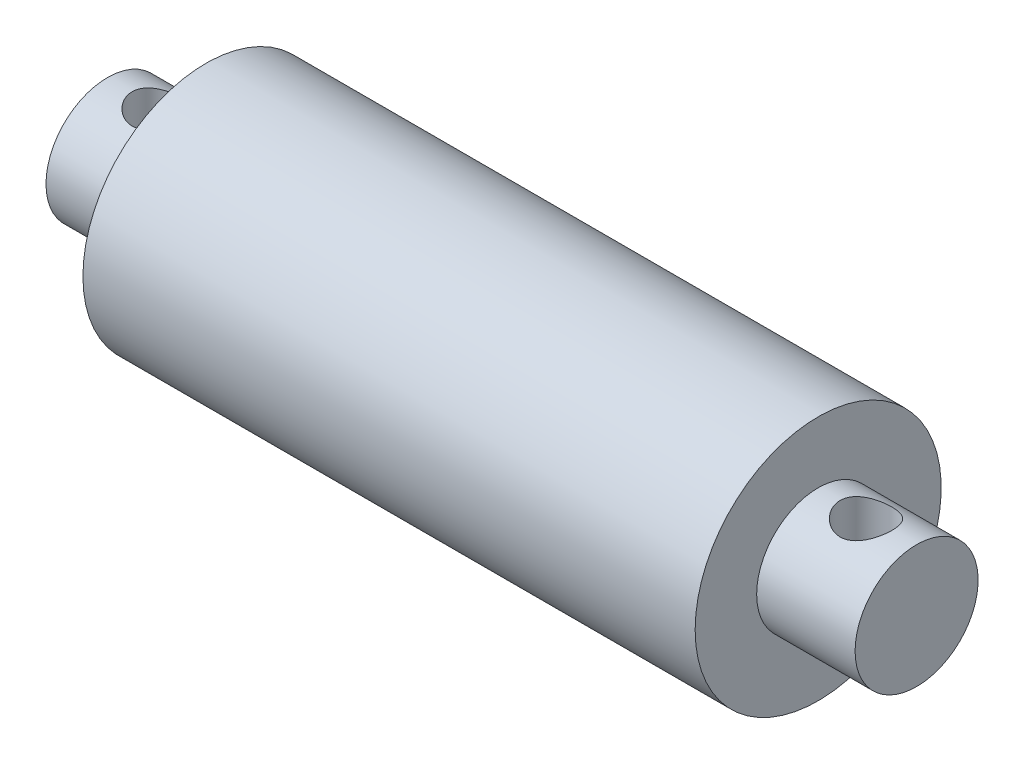
ISO-10303-21;
HEADER;
FILE_DESCRIPTION(('STEP AP214'),'2;1');
FILE_NAME('part.step','',(''),(''),'','','');
FILE_SCHEMA(('AUTOMOTIVE_DESIGN { 1 0 10303 214 1 1 1 1 }'));
ENDSEC;
DATA;
#1=APPLICATION_CONTEXT('core data for automotive mechanical design processes');
#2=APPLICATION_PROTOCOL_DEFINITION('international standard','automotive_design',2000,#1);
#3=PRODUCT_CONTEXT('',#1,'mechanical');
#4=PRODUCT('Part','Part','',(#3));
#5=PRODUCT_RELATED_PRODUCT_CATEGORY('part','',(#4));
#6=PRODUCT_DEFINITION_FORMATION('','',#4);
#7=PRODUCT_DEFINITION_CONTEXT('part definition',#1,'design');
#8=PRODUCT_DEFINITION('design','',#6,#7);
#9=PRODUCT_DEFINITION_SHAPE('','',#8);
#10=(LENGTH_UNIT() NAMED_UNIT(*) SI_UNIT(.MILLI.,.METRE.));
#11=(NAMED_UNIT(*) PLANE_ANGLE_UNIT() SI_UNIT($,.RADIAN.));
#12=(NAMED_UNIT(*) SI_UNIT($,.STERADIAN.) SOLID_ANGLE_UNIT());
#13=UNCERTAINTY_MEASURE_WITH_UNIT(LENGTH_MEASURE(1.E-05),#10,'distance_accuracy_value','');
#14=(GEOMETRIC_REPRESENTATION_CONTEXT(3) GLOBAL_UNCERTAINTY_ASSIGNED_CONTEXT((#13)) GLOBAL_UNIT_ASSIGNED_CONTEXT((#10,
#11,#12)) REPRESENTATION_CONTEXT('',''));
#15=CARTESIAN_POINT('',(0.,0.,0.));
#16=DIRECTION('',(0.,0.,1.));
#17=DIRECTION('',(1.,0.,0.));
#18=AXIS2_PLACEMENT_3D('',#15,#16,#17);
#19=CARTESIAN_POINT('',(-8.,5.,0.));
#20=DIRECTION('',(1.,0.,0.));
#21=DIRECTION('',(0.,0.,-1.));
#22=AXIS2_PLACEMENT_3D('',#19,#20,#21);
#23=PLANE('',#22);
#24=CARTESIAN_POINT('',(-8.,0.,0.));
#25=DIRECTION('',(-1.,0.,0.));
#26=DIRECTION('',(0.,0.,1.));
#27=AXIS2_PLACEMENT_3D('',#24,#25,#26);
#28=CIRCLE('',#27,5.);
#29=CARTESIAN_POINT('',(-8.,0.,5.));
#30=VERTEX_POINT('',#29);
#31=EDGE_CURVE('E105',#30,#30,#28,.T.);
#32=ORIENTED_EDGE('',*,*,#31,.T.);
#33=EDGE_LOOP('',(#32));
#34=FACE_BOUND('',#33,.T.);
#35=ADVANCED_FACE('F35',(#34),#23,.F.);
#36=CARTESIAN_POINT('',(57.7613747047361,0.,0.));
#37=DIRECTION('',(-1.,0.,0.));
#38=DIRECTION('',(0.,0.,1.));
#39=AXIS2_PLACEMENT_3D('',#36,#37,#38);
#40=PLANE('',#39);
#41=CARTESIAN_POINT('',(57.7613747047361,0.,0.));
#42=DIRECTION('',(-1.,0.,0.));
#43=DIRECTION('',(0.,0.,1.));
#44=AXIS2_PLACEMENT_3D('',#41,#42,#43);
#45=CIRCLE('',#44,5.);
#46=CARTESIAN_POINT('',(57.7613747047361,0.,5.));
#47=VERTEX_POINT('',#46);
#48=EDGE_CURVE('E10',#47,#47,#45,.T.);
#49=ORIENTED_EDGE('',*,*,#48,.F.);
#50=EDGE_LOOP('',(#49));
#51=FACE_BOUND('',#50,.T.);
#52=ADVANCED_FACE('F91',(#51),#40,.F.);
#53=CARTESIAN_POINT('',(0.,0.,0.));
#54=DIRECTION('',(-1.,0.,0.));
#55=DIRECTION('',(0.,0.,1.));
#56=AXIS2_PLACEMENT_3D('',#53,#54,#55);
#57=CYLINDRICAL_SURFACE('',#56,5.);
#58=CARTESIAN_POINT('',(53.6522092108573,-4.53392220451178,2.10797282796413));
#59=CARTESIAN_POINT('',(53.7645148360343,-4.53393126452061,2.10796365182828));
#60=CARTESIAN_POINT('',(53.8769834943885,-4.53815432726555,2.09894343729939));
#61=CARTESIAN_POINT('',(54.0986744684028,-4.55450008983298,2.06322372987654));
#62=CARTESIAN_POINT('',(54.2078872402225,-4.56664400368859,2.03647675715352));
#63=CARTESIAN_POINT('',(54.4194453221483,-4.59719274438838,1.96653413267773));
#64=CARTESIAN_POINT('',(54.521817041534,-4.61557160300665,1.92340661735643));
#65=CARTESIAN_POINT('',(54.7178439573154,-4.65648135656755,1.82212858294846));
#66=CARTESIAN_POINT('',(54.8115010651062,-4.67901133778924,1.76398136878054));
#67=CARTESIAN_POINT('',(54.9934647010857,-4.72729048989469,1.63035224731291));
#68=CARTESIAN_POINT('',(55.0811488848673,-4.75315046799956,1.55406253230274));
#69=CARTESIAN_POINT('',(55.2429400422495,-4.80426613795055,1.38800949549288));
#70=CARTESIAN_POINT('',(55.3170417079027,-4.82952159021467,1.29824093108299));
#71=CARTESIAN_POINT('',(55.4527652113987,-4.87793489478602,1.10286431577493));
#72=CARTESIAN_POINT('',(55.513683198194,-4.90094899103309,0.996728449096496));
#73=CARTESIAN_POINT('',(55.6165295414499,-4.94092605394646,0.774569274889423));
#74=CARTESIAN_POINT('',(55.6584665178343,-4.9578917666451,0.658550484034404));
#75=CARTESIAN_POINT('',(55.719893601463,-4.9830740238291,0.426456320661393));
#76=CARTESIAN_POINT('',(55.7404578670223,-4.9917074960429,0.31071140756497));
#77=CARTESIAN_POINT('',(55.7620303030249,-5.00076926622417,0.0771135183453877));
#78=CARTESIAN_POINT('',(55.7630466057057,-5.00120097624338,-0.0407385607412112));
#79=CARTESIAN_POINT('',(55.7460491926501,-4.99405352336418,-0.267381076621825));
#80=CARTESIAN_POINT('',(55.7292167187981,-4.98697160074535,-0.376278749715031));
#81=CARTESIAN_POINT('',(55.6790292560848,-4.96627926586478,-0.589535512016994));
#82=CARTESIAN_POINT('',(55.6456730478165,-4.95266837178489,-0.693894265647357));
#83=CARTESIAN_POINT('',(55.562993555169,-4.91996835307052,-0.897032147424678));
#84=CARTESIAN_POINT('',(55.5134340089591,-4.90079867424717,-0.995701610633314));
#85=CARTESIAN_POINT('',(55.3999895287538,-4.85884886839864,-1.18358264199499));
#86=CARTESIAN_POINT('',(55.336099494632,-4.83606745682987,-1.27279082625211));
#87=CARTESIAN_POINT('',(55.1904669168268,-4.78723850918267,-1.44603642524125));
#88=CARTESIAN_POINT('',(55.1077708546436,-4.76107391001653,-1.52924045457392));
#89=CARTESIAN_POINT('',(54.9295542930777,-4.70964841782169,-1.68096492916577));
#90=CARTESIAN_POINT('',(54.8340286323476,-4.68438789370926,-1.74947943587771));
#91=CARTESIAN_POINT('',(54.6287304380224,-4.63678299177504,-1.87209191873399));
#92=CARTESIAN_POINT('',(54.5185814286472,-4.61456847321368,-1.9256143214498));
#93=CARTESIAN_POINT('',(54.2896489003594,-4.5771262781121,-2.01300822420984));
#94=CARTESIAN_POINT('',(54.1708717987393,-4.56189346921347,-2.04689416416896));
#95=CARTESIAN_POINT('',(53.9364131034669,-4.54142090807606,-2.09190631481807));
#96=CARTESIAN_POINT('',(53.8210441665146,-4.53558824289424,-2.10438643121739));
#97=CARTESIAN_POINT('',(53.5897378914652,-4.53287995387389,-2.11021729379587));
#98=CARTESIAN_POINT('',(53.4738007729337,-4.53600110640162,-2.1035749246207));
#99=CARTESIAN_POINT('',(53.2527451347613,-4.55023502235409,-2.07258567555274));
#100=CARTESIAN_POINT('',(53.1474186557148,-4.56080479530559,-2.04944053567334));
#101=CARTESIAN_POINT('',(52.9422361551895,-4.58804501558294,-1.9877053802609));
#102=CARTESIAN_POINT('',(52.8423814391556,-4.60471691152087,-1.94911169712061));
#103=CARTESIAN_POINT('',(52.6461935334005,-4.64315160319953,-1.8557446004085));
#104=CARTESIAN_POINT('',(52.5501943935602,-4.66510187382424,-1.80034895384158));
#105=CARTESIAN_POINT('',(52.3683859223337,-4.71135938190267,-1.67556449667438));
#106=CARTESIAN_POINT('',(52.282581101148,-4.73566765401501,-1.60616952881407));
#107=CARTESIAN_POINT('',(52.1161173700563,-4.78635781091311,-1.44851102464813));
#108=CARTESIAN_POINT('',(52.036490802967,-4.81274290888157,-1.35915416001388));
#109=CARTESIAN_POINT('',(51.8931695139737,-4.86273095501379,-1.16774225806985));
#110=CARTESIAN_POINT('',(51.8294761304227,-4.88633366937534,-1.06568615512892));
#111=CARTESIAN_POINT('',(51.7198427555773,-4.9282765966158,-0.850932054608501));
#112=CARTESIAN_POINT('',(51.6739656221468,-4.9465981192778,-0.738198092908469));
#113=CARTESIAN_POINT('',(51.6021695585122,-4.97574374724406,-0.505639488840572));
#114=CARTESIAN_POINT('',(51.576238435898,-4.98657243229245,-0.385819226439766));
#115=CARTESIAN_POINT('',(51.5466323815978,-4.99897415794318,-0.151705053419508));
#116=CARTESIAN_POINT('',(51.5415029568313,-5.00115184879871,-0.037625902041582));
#117=CARTESIAN_POINT('',(51.5497145991281,-4.99769127240114,0.189731920425568));
#118=CARTESIAN_POINT('',(51.5630522903137,-4.99205443368147,0.303010734015885));
#119=CARTESIAN_POINT('',(51.6067752731994,-4.97391980701813,0.521230108955551));
#120=CARTESIAN_POINT('',(51.6365122300806,-4.96168331430606,0.626324108465678));
#121=CARTESIAN_POINT('',(51.7114733147528,-4.93170656668953,0.829985153709064));
#122=CARTESIAN_POINT('',(51.7567003477186,-4.91396527941564,0.928550970935732));
#123=CARTESIAN_POINT('',(51.8636485946216,-4.87368845534365,1.12129145666335));
#124=CARTESIAN_POINT('',(51.9260254196992,-4.8509718284115,1.21506361196488));
#125=CARTESIAN_POINT('',(52.0645551588816,-4.80342217014618,1.39121276098037));
#126=CARTESIAN_POINT('',(52.1407133313456,-4.77858833289767,1.47358538388663));
#127=CARTESIAN_POINT('',(52.3109295495391,-4.72741515063654,1.63059397792408));
#128=CARTESIAN_POINT('',(52.4058669699579,-4.70109198583642,1.70428593163243));
#129=CARTESIAN_POINT('',(52.607531127786,-4.65169243113673,1.83484159713954));
#130=CARTESIAN_POINT('',(52.7142645099983,-4.62861788803547,1.89169575697951));
#131=CARTESIAN_POINT('',(52.9365762852026,-4.58876353829586,1.98643258088008));
#132=CARTESIAN_POINT('',(53.0521177941657,-4.57195905030247,2.02438983215493));
#133=CARTESIAN_POINT('',(53.2293827732683,-4.55321326268301,2.06602568411457));
#134=CARTESIAN_POINT('',(53.2890704878264,-4.54804337117675,2.07735072861271));
#135=CARTESIAN_POINT('',(53.4093436898916,-4.54002811541587,2.0948137752391));
#136=CARTESIAN_POINT('',(53.4699285267369,-4.53718114312445,2.10095536570588));
#137=CARTESIAN_POINT('',(53.5711308482258,-4.53446503763364,2.10680469358187));
#138=CARTESIAN_POINT('',(53.611659402299,-4.53391893324533,2.10797614116016));
#139=CARTESIAN_POINT('',(53.6522092108573,-4.53392220451178,2.10797282796413));
#140=B_SPLINE_CURVE_WITH_KNOTS('',3,(#58,#59,#60,#61,#62,#63,#64,#65,#66,#67,#68,#69,#70,#71,
#72,#73,#74,#75,#76,#77,#78,#79,#80,#81,#82,#83,#84,#85,#86,#87,#88,#89,#90,#91,#92,#93,#94,#95,
#96,#97,#98,#99,#100,#101,#102,#103,#104,#105,#106,#107,#108,#109,#110,#111,#112,#113,#114,#115,
#116,#117,#118,#119,#120,#121,#122,#123,#124,#125,#126,#127,#128,#129,#130,#131,#132,#133,#134,
#135,#136,#137,#138,#139),.UNSPECIFIED.,.T.,.F.,(4,2,2,2,2,2,2,2,2,2,2,2,2,2,2,2,2,2,2,2,2,2,2,
2,2,2,2,2,2,2,2,2,2,2,2,2,2,2,2,2,4),(0.,0.336773059413411,0.674451806110292,1.01074106139087,
1.34695638287847,1.7026088463982,2.05840000131312,2.43005665823412,2.80154436343194,
3.1532962540631,3.50490180761188,3.83460947199205,4.16434147153413,4.49911338330698,
4.83400462778162,5.19298265567532,5.55210553544848,5.92355534262223,6.29473165183893,
6.64142309640958,6.98798973768437,7.31160263449943,7.63529240520402,7.97284710963121,
8.31055060422509,8.67652867469581,9.04253747621983,9.40982611688358,9.77689006598665,
10.1177931848577,10.4586339932221,10.7868766512691,11.1151809052052,11.4583900523618,
11.8017304302936,12.1690837094191,12.5366449879652,12.9027437446957,13.0854414511318,
13.2680125778394,13.38961007632),.UNSPECIFIED.);
#141=CARTESIAN_POINT('',(53.6522092108573,-4.53392220451178,2.10797282796413));
#142=VERTEX_POINT('',#141);
#143=EDGE_CURVE('E38',#142,#142,#140,.T.);
#144=ORIENTED_EDGE('',*,*,#143,.T.);
#145=EDGE_LOOP('',(#144));
#146=FACE_BOUND('',#145,.T.);
#147=CARTESIAN_POINT('',(53.6522092108573,4.53392220451178,2.10797282796413));
#148=CARTESIAN_POINT('',(53.5399035856803,4.53393126452061,2.10796365182828));
#149=CARTESIAN_POINT('',(53.4274349273261,4.53815432726555,2.09894343729939));
#150=CARTESIAN_POINT('',(53.2057439533119,4.55450008983298,2.06322372987654));
#151=CARTESIAN_POINT('',(53.0965311814922,4.56664400368859,2.03647675715352));
#152=CARTESIAN_POINT('',(52.8849730995664,4.59719274438838,1.96653413267773));
#153=CARTESIAN_POINT('',(52.7826013801807,4.61557160300665,1.92340661735643));
#154=CARTESIAN_POINT('',(52.5865744643993,4.65648135656755,1.82212858294846));
#155=CARTESIAN_POINT('',(52.4929173566085,4.67901133778924,1.76398136878054));
#156=CARTESIAN_POINT('',(52.310953720629,4.72729048989469,1.63035224731291));
#157=CARTESIAN_POINT('',(52.2232695368474,4.75315046799956,1.55406253230274));
#158=CARTESIAN_POINT('',(52.0614783794652,4.80426613795055,1.38800949549288));
#159=CARTESIAN_POINT('',(51.987376713812,4.82952159021467,1.29824093108298));
#160=CARTESIAN_POINT('',(51.851653210316,4.87793489478602,1.10286431577493));
#161=CARTESIAN_POINT('',(51.7907352235207,4.90094899103309,0.996728449096496));
#162=CARTESIAN_POINT('',(51.6878888802647,4.94092605394646,0.774569274889423));
#163=CARTESIAN_POINT('',(51.6459519038804,4.9578917666451,0.658550484034404));
#164=CARTESIAN_POINT('',(51.5845248202517,4.9830740238291,0.426456320661393));
#165=CARTESIAN_POINT('',(51.5639605546924,4.9917074960429,0.31071140756497));
#166=CARTESIAN_POINT('',(51.5423881186898,5.00076926622417,0.0771135183453877));
#167=CARTESIAN_POINT('',(51.5413718160089,5.00120097624338,-0.0407385607412112));
#168=CARTESIAN_POINT('',(51.5583692290646,4.99405352336418,-0.267381076621825));
#169=CARTESIAN_POINT('',(51.5752017029166,4.98697160074535,-0.376278749715031));
#170=CARTESIAN_POINT('',(51.6253891656298,4.96627926586478,-0.589535512016994));
#171=CARTESIAN_POINT('',(51.6587453738981,4.95266837178489,-0.693894265647357));
#172=CARTESIAN_POINT('',(51.7414248665457,4.91996835307052,-0.897032147424678));
#173=CARTESIAN_POINT('',(51.7909844127556,4.90079867424717,-0.995701610633314));
#174=CARTESIAN_POINT('',(51.9044288929608,4.85884886839864,-1.18358264199499));
#175=CARTESIAN_POINT('',(51.9683189270827,4.83606745682987,-1.27279082625211));
#176=CARTESIAN_POINT('',(52.1139515048879,4.78723850918267,-1.44603642524126));
#177=CARTESIAN_POINT('',(52.1966475670711,4.76107391001652,-1.52924045457393));
#178=CARTESIAN_POINT('',(52.374864128637,4.70964841782168,-1.68096492916578));
#179=CARTESIAN_POINT('',(52.4703897893671,4.68438789370926,-1.74947943587771));
#180=CARTESIAN_POINT('',(52.6756879836922,4.63678299177504,-1.87209191873399));
#181=CARTESIAN_POINT('',(52.7858369930674,4.61456847321368,-1.9256143214498));
#182=CARTESIAN_POINT('',(53.0147695213553,4.5771262781121,-2.01300822420984));
#183=CARTESIAN_POINT('',(53.1335466229754,4.56189346921347,-2.04689416416896));
#184=CARTESIAN_POINT('',(53.3680053182478,4.54142090807605,-2.09190631481807));
#185=CARTESIAN_POINT('',(53.4833742552001,4.53558824289424,-2.10438643121739));
#186=CARTESIAN_POINT('',(53.7146805302495,4.53287995387389,-2.11021729379587));
#187=CARTESIAN_POINT('',(53.830617648781,4.53600110640162,-2.10357492462069));
#188=CARTESIAN_POINT('',(54.0516732869534,4.55023502235409,-2.07258567555274));
#189=CARTESIAN_POINT('',(54.1569997659999,4.56080479530559,-2.04944053567334));
#190=CARTESIAN_POINT('',(54.3621822665251,4.58804501558294,-1.9877053802609));
#191=CARTESIAN_POINT('',(54.4620369825591,4.60471691152087,-1.94911169712061));
#192=CARTESIAN_POINT('',(54.6582248883141,4.64315160319953,-1.8557446004085));
#193=CARTESIAN_POINT('',(54.7542240281544,4.66510187382424,-1.80034895384158));
#194=CARTESIAN_POINT('',(54.936032499381,4.71135938190267,-1.67556449667438));
#195=CARTESIAN_POINT('',(55.0218373205667,4.73566765401501,-1.60616952881407));
#196=CARTESIAN_POINT('',(55.1883010516584,4.78635781091311,-1.44851102464813));
#197=CARTESIAN_POINT('',(55.2679276187476,4.81274290888157,-1.35915416001388));
#198=CARTESIAN_POINT('',(55.411248907741,4.86273095501379,-1.16774225806985));
#199=CARTESIAN_POINT('',(55.474942291292,4.88633366937534,-1.06568615512892));
#200=CARTESIAN_POINT('',(55.5845756661373,4.9282765966158,-0.850932054608501));
#201=CARTESIAN_POINT('',(55.6304527995679,4.9465981192778,-0.738198092908469));
#202=CARTESIAN_POINT('',(55.7022488632025,4.97574374724406,-0.505639488840572));
#203=CARTESIAN_POINT('',(55.7281799858166,4.98657243229245,-0.385819226439766));
#204=CARTESIAN_POINT('',(55.7577860401168,4.99897415794318,-0.151705053419508));
#205=CARTESIAN_POINT('',(55.7629154648834,5.00115184879871,-0.037625902041582));
#206=CARTESIAN_POINT('',(55.7547038225865,4.99769127240114,0.189731920425568));
#207=CARTESIAN_POINT('',(55.7413661314009,4.99205443368147,0.303010734015885));
#208=CARTESIAN_POINT('',(55.6976431485153,4.97391980701813,0.521230108955551));
#209=CARTESIAN_POINT('',(55.667906191634,4.96168331430606,0.626324108465678));
#210=CARTESIAN_POINT('',(55.5929451069619,4.93170656668953,0.829985153709064));
#211=CARTESIAN_POINT('',(55.547718073996,4.91396527941564,0.928550970935732));
#212=CARTESIAN_POINT('',(55.4407698270931,4.87368845534365,1.12129145666335));
#213=CARTESIAN_POINT('',(55.3783930020155,4.8509718284115,1.21506361196488));
#214=CARTESIAN_POINT('',(55.239863262833,4.80342217014618,1.39121276098037));
#215=CARTESIAN_POINT('',(55.1637050903691,4.77858833289767,1.47358538388663));
#216=CARTESIAN_POINT('',(54.9934888721755,4.72741515063654,1.63059397792408));
#217=CARTESIAN_POINT('',(54.8985514517568,4.70109198583642,1.70428593163243));
#218=CARTESIAN_POINT('',(54.6968872939287,4.65169243113673,1.83484159713954));
#219=CARTESIAN_POINT('',(54.5901539117163,4.62861788803547,1.89169575697951));
#220=CARTESIAN_POINT('',(54.3678421365121,4.58876353829586,1.98643258088008));
#221=CARTESIAN_POINT('',(54.252300627549,4.57195905030247,2.02438983215493));
#222=CARTESIAN_POINT('',(54.0750356484464,4.55321326268301,2.06602568411457));
#223=CARTESIAN_POINT('',(54.0153479338883,4.54804337117675,2.07735072861271));
#224=CARTESIAN_POINT('',(53.8950747318231,4.54002811541587,2.0948137752391));
#225=CARTESIAN_POINT('',(53.8344898949778,4.53718114312445,2.10095536570588));
#226=CARTESIAN_POINT('',(53.7332875734889,4.53446503763364,2.10680469358187));
#227=CARTESIAN_POINT('',(53.6927590194157,4.53391893324533,2.10797614116016));
#228=CARTESIAN_POINT('',(53.6522092108573,4.53392220451178,2.10797282796413));
#229=B_SPLINE_CURVE_WITH_KNOTS('',3,(#147,#148,#149,#150,#151,#152,#153,#154,#155,#156,#157,
#158,#159,#160,#161,#162,#163,#164,#165,#166,#167,#168,#169,#170,#171,#172,#173,#174,#175,#176,
#177,#178,#179,#180,#181,#182,#183,#184,#185,#186,#187,#188,#189,#190,#191,#192,#193,#194,#195,
#196,#197,#198,#199,#200,#201,#202,#203,#204,#205,#206,#207,#208,#209,#210,#211,#212,#213,#214,
#215,#216,#217,#218,#219,#220,#221,#222,#223,#224,#225,#226,#227,#228),.UNSPECIFIED.,.T.,.F.,(4,
2,2,2,2,2,2,2,2,2,2,2,2,2,2,2,2,2,2,2,2,2,2,2,2,2,2,2,2,2,2,2,2,2,2,2,2,2,2,2,4),(0.,
0.336773059413411,0.674451806110292,1.01074106139087,1.34695638287847,1.70260884639821,
2.05840000131312,2.43005665823413,2.80154436343194,3.1532962540631,3.50490180761188,
3.83460947199205,4.16434147153413,4.49911338330698,4.83400462778162,5.19298265567534,
5.55210553544848,5.92355534262223,6.29473165183893,6.6414230964096,6.98798973768437,
7.31160263449943,7.63529240520402,7.97284710963121,8.31055060422509,8.67652867469581,
9.04253747621983,9.40982611688358,9.77689006598665,10.1177931848577,10.4586339932221,
10.7868766512691,11.1151809052052,11.4583900523618,11.8017304302936,12.1690837094191,
12.5366449879652,12.9027437446957,13.0854414511318,13.2680125778394,13.38961007632),.UNSPECIFIED.);
#230=CARTESIAN_POINT('',(53.6522092108573,4.53392220451178,2.10797282796413));
#231=VERTEX_POINT('',#230);
#232=EDGE_CURVE('E81',#231,#231,#229,.T.);
#233=ORIENTED_EDGE('',*,*,#232,.T.);
#234=EDGE_LOOP('',(#233));
#235=FACE_BOUND('',#234,.T.);
#236=CARTESIAN_POINT('',(49.7613747047361,0.,0.));
#237=DIRECTION('',(-1.,0.,0.));
#238=DIRECTION('',(0.,0.,1.));
#239=AXIS2_PLACEMENT_3D('',#236,#237,#238);
#240=CIRCLE('',#239,5.);
#241=CARTESIAN_POINT('',(49.7613747047361,0.,5.));
#242=VERTEX_POINT('',#241);
#243=EDGE_CURVE('E47',#242,#242,#240,.T.);
#244=ORIENTED_EDGE('',*,*,#243,.F.);
#245=EDGE_LOOP('',(#244));
#246=FACE_BOUND('',#245,.T.);
#247=ORIENTED_EDGE('',*,*,#48,.T.);
#248=EDGE_LOOP('',(#247));
#249=FACE_BOUND('',#248,.T.);
#250=ADVANCED_FACE('F86',(#146,#235,#246,#249),#57,.T.);
#251=CARTESIAN_POINT('',(49.7613747047361,5.,0.));
#252=DIRECTION('',(-1.,0.,0.));
#253=DIRECTION('',(0.,0.,1.));
#254=AXIS2_PLACEMENT_3D('',#251,#252,#253);
#255=PLANE('',#254);
#256=CARTESIAN_POINT('',(49.7613747047361,0.,0.));
#257=DIRECTION('',(-1.,0.,0.));
#258=DIRECTION('',(0.,0.,1.));
#259=AXIS2_PLACEMENT_3D('',#256,#257,#258);
#260=CIRCLE('',#259,10.);
#261=CARTESIAN_POINT('',(49.7613747047361,0.,10.));
#262=VERTEX_POINT('',#261);
#263=EDGE_CURVE('E52',#262,#262,#260,.T.);
#264=ORIENTED_EDGE('',*,*,#263,.F.);
#265=EDGE_LOOP('',(#264));
#266=FACE_BOUND('',#265,.T.);
#267=ORIENTED_EDGE('',*,*,#243,.T.);
#268=EDGE_LOOP('',(#267));
#269=FACE_BOUND('',#268,.T.);
#270=ADVANCED_FACE('F90',(#266,#269),#255,.F.);
#271=CARTESIAN_POINT('',(0.,0.,0.));
#272=DIRECTION('',(-1.,0.,0.));
#273=DIRECTION('',(0.,0.,1.));
#274=AXIS2_PLACEMENT_3D('',#271,#272,#273);
#275=CYLINDRICAL_SURFACE('',#274,10.);
#276=CARTESIAN_POINT('',(0.,0.,0.));
#277=DIRECTION('',(-1.,0.,0.));
#278=DIRECTION('',(0.,0.,1.));
#279=AXIS2_PLACEMENT_3D('',#276,#277,#278);
#280=CIRCLE('',#279,10.);
#281=CARTESIAN_POINT('',(0.,0.,10.));
#282=VERTEX_POINT('',#281);
#283=EDGE_CURVE('E110',#282,#282,#280,.T.);
#284=ORIENTED_EDGE('',*,*,#283,.F.);
#285=EDGE_LOOP('',(#284));
#286=FACE_BOUND('',#285,.T.);
#287=ORIENTED_EDGE('',*,*,#263,.T.);
#288=EDGE_LOOP('',(#287));
#289=FACE_BOUND('',#288,.T.);
#290=ADVANCED_FACE('F118',(#286,#289),#275,.T.);
#291=CARTESIAN_POINT('',(0.,10.,0.));
#292=DIRECTION('',(1.,0.,0.));
#293=DIRECTION('',(0.,0.,-1.));
#294=AXIS2_PLACEMENT_3D('',#291,#292,#293);
#295=PLANE('',#294);
#296=CARTESIAN_POINT('',(0.,0.,0.));
#297=DIRECTION('',(-1.,0.,0.));
#298=DIRECTION('',(0.,0.,1.));
#299=AXIS2_PLACEMENT_3D('',#296,#297,#298);
#300=CIRCLE('',#299,5.);
#301=CARTESIAN_POINT('',(0.,0.,5.));
#302=VERTEX_POINT('',#301);
#303=EDGE_CURVE('E107',#302,#302,#300,.T.);
#304=ORIENTED_EDGE('',*,*,#303,.F.);
#305=EDGE_LOOP('',(#304));
#306=FACE_BOUND('',#305,.T.);
#307=ORIENTED_EDGE('',*,*,#283,.T.);
#308=EDGE_LOOP('',(#307));
#309=FACE_BOUND('',#308,.T.);
#310=ADVANCED_FACE('F127',(#306,#309),#295,.F.);
#311=CARTESIAN_POINT('',(0.,0.,0.));
#312=DIRECTION('',(-1.,0.,0.));
#313=DIRECTION('',(0.,0.,1.));
#314=AXIS2_PLACEMENT_3D('',#311,#312,#313);
#315=CYLINDRICAL_SURFACE('',#314,5.);
#316=CARTESIAN_POINT('',(-4.,-4.58257569495584,2.));
#317=CARTESIAN_POINT('',(-3.89287631028704,-4.58258022779737,1.99999540068022));
#318=CARTESIAN_POINT('',(-3.78557370566816,-4.58638433797123,1.99134173553407));
#319=CARTESIAN_POINT('',(-3.57406091590043,-4.601110833066,1.95706710874823));
#320=CARTESIAN_POINT('',(-3.46985934566148,-4.61205140628347,1.93140279032341));
#321=CARTESIAN_POINT('',(-3.26794819102917,-4.63960410719222,1.86423554476216));
#322=CARTESIAN_POINT('',(-3.17021575670878,-4.65619484260882,1.82279228998551));
#323=CARTESIAN_POINT('',(-2.9831146451377,-4.69314677188873,1.72542013194152));
#324=CARTESIAN_POINT('',(-2.89374414747589,-4.71350714220611,1.66949439157707));
#325=CARTESIAN_POINT('',(-2.72073968545567,-4.75700861562336,1.54132201423254));
#326=CARTESIAN_POINT('',(-2.63764360060276,-4.78023917022606,1.46837936836551));
#327=CARTESIAN_POINT('',(-2.4844709791442,-4.82612457915278,1.30970909513215));
#328=CARTESIAN_POINT('',(-2.4143989922903,-4.84877922991761,1.22397701877347));
#329=CARTESIAN_POINT('',(-2.28659360969029,-4.89203407641395,1.03800631337303));
#330=CARTESIAN_POINT('',(-2.22945570031406,-4.9125180361257,0.937328966419093));
#331=CARTESIAN_POINT('',(-2.13315642982621,-4.94803927702516,0.726825322068638));
#332=CARTESIAN_POINT('',(-2.09398775375113,-4.96307877403249,0.617002769076883));
#333=CARTESIAN_POINT('',(-2.03665851400691,-4.98538324990609,0.396966427039754));
#334=CARTESIAN_POINT('',(-2.01757268602978,-4.99298936770628,0.287028984858317));
#335=CARTESIAN_POINT('',(-1.99797151421855,-5.00080310687431,0.0652663285839622));
#336=CARTESIAN_POINT('',(-1.9974492440342,-5.00101348770556,-0.0465581658394111));
#337=CARTESIAN_POINT('',(-2.0144827698042,-4.99421962820612,-0.262232494702089));
#338=CARTESIAN_POINT('',(-2.03102477275472,-4.98761996771485,-0.366177452870457));
#339=CARTESIAN_POINT('',(-2.07999287630297,-4.96849291469141,-0.569673109221914));
#340=CARTESIAN_POINT('',(-2.11242014239846,-4.95596508721342,-0.669223484391239));
#341=CARTESIAN_POINT('',(-2.19263648287826,-4.92596824457467,-0.862897938510558));
#342=CARTESIAN_POINT('',(-2.24064971481538,-4.90842760466223,-0.956917623378896));
#343=CARTESIAN_POINT('',(-2.35046500691916,-4.87014585180275,-1.13580815074131));
#344=CARTESIAN_POINT('',(-2.41227179310017,-4.84940364267149,-1.22067584271796));
#345=CARTESIAN_POINT('',(-2.55264913594388,-4.80521637176123,-1.38476882799018));
#346=CARTESIAN_POINT('',(-2.6320538925728,-4.78168326511759,-1.46325784526632));
#347=CARTESIAN_POINT('',(-2.802990571832,-4.73561660973263,-1.60610741539265));
#348=CARTESIAN_POINT('',(-2.8945264481956,-4.71308339008077,-1.67046334378698));
#349=CARTESIAN_POINT('',(-3.09041902237394,-4.67096897409023,-1.78490418871927));
#350=CARTESIAN_POINT('',(-3.19506483033865,-4.65148914057708,-1.83453465163626));
#351=CARTESIAN_POINT('',(-3.41221549031222,-4.61887590344084,-1.91517625986646));
#352=CARTESIAN_POINT('',(-3.52471518472659,-4.60573837891311,-1.94619949837798));
#353=CARTESIAN_POINT('',(-3.74703577746744,-4.58829759702716,-1.9869549488549));
#354=CARTESIAN_POINT('',(-3.85660044712856,-4.58350366456138,-1.99787209681454));
#355=CARTESIAN_POINT('',(-4.07607720775956,-4.58189497869038,-2.00156132644289));
#356=CARTESIAN_POINT('',(-4.18598918327565,-4.58507780560362,-1.99433891059128));
#357=CARTESIAN_POINT('',(-4.39645893495694,-4.59856044359114,-1.96303289479003));
#358=CARTESIAN_POINT('',(-4.49719293740006,-4.60844457798302,-1.93993306202386));
#359=CARTESIAN_POINT('',(-4.69328840478545,-4.6337005102734,-1.87880418691087));
#360=CARTESIAN_POINT('',(-4.78864867310715,-4.64907352488598,-1.84077183430228));
#361=CARTESIAN_POINT('',(-4.97560235779566,-4.68433781860101,-1.74913563948157));
#362=CARTESIAN_POINT('',(-5.06688618869453,-4.70438704639177,-1.69496286826465));
#363=CARTESIAN_POINT('',(-5.23948298744159,-4.74650385157795,-1.57316522444182));
#364=CARTESIAN_POINT('',(-5.32079187279545,-4.76857224896045,-1.50553487348189));
#365=CARTESIAN_POINT('',(-5.47737340859937,-4.81420915971417,-1.35284421168058));
#366=CARTESIAN_POINT('',(-5.5517565652916,-4.83776807285233,-1.26686542944544));
#367=CARTESIAN_POINT('',(-5.68517707660977,-4.88219794567532,-1.08308363336851));
#368=CARTESIAN_POINT('',(-5.74421380659512,-4.90306879593136,-0.985280138466608));
#369=CARTESIAN_POINT('',(-5.84504762646334,-4.9398371590039,-0.780279934003015));
#370=CARTESIAN_POINT('',(-5.88684884417366,-4.9557358624066,-0.673085480998746));
#371=CARTESIAN_POINT('',(-5.95154885239976,-4.98072713468904,-0.452393590914548));
#372=CARTESIAN_POINT('',(-5.97445790141069,-4.98982339706103,-0.338899610276819));
#373=CARTESIAN_POINT('',(-5.99950470165285,-4.99979008211858,-0.116816510362614));
#374=CARTESIAN_POINT('',(-6.00290012856203,-5.00115846749745,-0.00839049265208604));
#375=CARTESIAN_POINT('',(-5.99214452061653,-4.99686042373721,0.207433835792266));
#376=CARTESIAN_POINT('',(-5.97799614184442,-4.99119505948774,0.314832299614387));
#377=CARTESIAN_POINT('',(-5.93345321200012,-4.97371513381836,0.522170901733397));
#378=CARTESIAN_POINT('',(-5.90357105524345,-4.96209480698998,0.622238803864868));
#379=CARTESIAN_POINT('',(-5.82894719411893,-4.93394947767358,0.815922355542603));
#380=CARTESIAN_POINT('',(-5.78420274906091,-4.91742357062859,0.909536811189121));
#381=CARTESIAN_POINT('',(-5.67889680664677,-4.88018094611867,1.09220303880515));
#382=CARTESIAN_POINT('',(-5.61772372467487,-4.859311306872,1.18087037518738));
#383=CARTESIAN_POINT('',(-5.48221146125301,-4.8158940222708,1.34705404014793));
#384=CARTESIAN_POINT('',(-5.40786683039179,-4.79334568464253,1.42456572919735));
#385=CARTESIAN_POINT('',(-5.24268485315134,-4.7473776736768,1.57120121894449));
#386=CARTESIAN_POINT('',(-5.1511114248559,-4.72399047228096,1.63950871002775));
#387=CARTESIAN_POINT('',(-4.95705756427917,-4.6804965685075,1.75984762763149));
#388=CARTESIAN_POINT('',(-4.85457585154646,-4.66039025195448,1.81187714055767));
#389=CARTESIAN_POINT('',(-4.6509638135298,-4.62758914239064,1.89399048451634));
#390=CARTESIAN_POINT('',(-4.55053839728756,-4.61439096680415,1.92562535665267));
#391=CARTESIAN_POINT('',(-4.34551095850736,-4.5944582603412,1.97271990928489));
#392=CARTESIAN_POINT('',(-4.24092142657564,-4.58770572290435,1.98822466191608));
#393=CARTESIAN_POINT('',(-4.11322176088848,-4.5839176394209,1.99692202185513));
#394=CARTESIAN_POINT('',(-4.09059851964357,-4.58341531117284,1.99807530751895));
#395=CARTESIAN_POINT('',(-4.04531952320278,-4.58274384722723,1.9996148112425));
#396=CARTESIAN_POINT('',(-4.02266376574484,-4.5825747359592,2.0000009730612));
#397=CARTESIAN_POINT('',(-4.,-4.58257569495584,2.));
#398=B_SPLINE_CURVE_WITH_KNOTS('',3,(#316,#317,#318,#319,#320,#321,#322,#323,#324,#325,#326,
#327,#328,#329,#330,#331,#332,#333,#334,#335,#336,#337,#338,#339,#340,#341,#342,#343,#344,#345,
#346,#347,#348,#349,#350,#351,#352,#353,#354,#355,#356,#357,#358,#359,#360,#361,#362,#363,#364,
#365,#366,#367,#368,#369,#370,#371,#372,#373,#374,#375,#376,#377,#378,#379,#380,#381,#382,#383,
#384,#385,#386,#387,#388,#389,#390,#391,#392,#393,#394,#395,#396,#397),.UNSPECIFIED.,.T.,.F.,(4,
2,2,2,2,2,2,2,2,2,2,2,2,2,2,2,2,2,2,2,2,2,2,2,2,2,2,2,2,2,2,2,2,2,2,2,2,2,2,2,4),(0.,
0.321277648767654,0.643377335822246,0.96427082329339,1.28509428823861,1.62255618284425,
1.96013574348342,2.31102669091428,2.6617746696948,2.99554182887183,3.32918445305672,
3.64408644830302,3.95901155129059,4.27868300234898,4.59846414940031,4.93924044081356,
5.28012807127127,5.63064458717257,5.98093304800101,6.30982147524421,6.63861014907939,
6.94867248085145,7.25880358651638,7.58151154652701,7.9043511452585,8.2510373424698,
8.59773764852748,8.94435487312812,9.29078375954136,9.61461039755953,9.93838801512602,
10.2522199444335,10.5661097782859,10.8938705113993,11.2217671656421,11.5699625328561,
11.9181988175919,12.2351666081908,12.5512463021924,12.619212852096,12.6871843847256),.UNSPECIFIED.);
#399=CARTESIAN_POINT('',(-4.,-4.58257569495584,2.));
#400=VERTEX_POINT('',#399);
#401=EDGE_CURVE('E64',#400,#400,#398,.T.);
#402=ORIENTED_EDGE('',*,*,#401,.T.);
#403=EDGE_LOOP('',(#402));
#404=FACE_BOUND('',#403,.T.);
#405=CARTESIAN_POINT('',(-4.,4.58257569495584,2.));
#406=CARTESIAN_POINT('',(-4.10712368971296,4.58258022779737,1.99999540068022));
#407=CARTESIAN_POINT('',(-4.21442629433184,4.58638433797123,1.99134173553407));
#408=CARTESIAN_POINT('',(-4.42593908409957,4.601110833066,1.95706710874823));
#409=CARTESIAN_POINT('',(-4.53014065433852,4.61205140628347,1.93140279032341));
#410=CARTESIAN_POINT('',(-4.73205180897083,4.63960410719222,1.86423554476216));
#411=CARTESIAN_POINT('',(-4.82978424329122,4.65619484260882,1.82279228998551));
#412=CARTESIAN_POINT('',(-5.0168853548623,4.69314677188873,1.72542013194152));
#413=CARTESIAN_POINT('',(-5.10625585252411,4.71350714220611,1.66949439157707));
#414=CARTESIAN_POINT('',(-5.27926031454433,4.75700861562336,1.54132201423254));
#415=CARTESIAN_POINT('',(-5.36235639939724,4.78023917022606,1.46837936836551));
#416=CARTESIAN_POINT('',(-5.5155290208558,4.82612457915278,1.30970909513215));
#417=CARTESIAN_POINT('',(-5.5856010077097,4.84877922991761,1.22397701877347));
#418=CARTESIAN_POINT('',(-5.71340639030971,4.89203407641395,1.03800631337303));
#419=CARTESIAN_POINT('',(-5.77054429968594,4.9125180361257,0.937328966419094));
#420=CARTESIAN_POINT('',(-5.86684357017379,4.94803927702516,0.726825322068639));
#421=CARTESIAN_POINT('',(-5.90601224624887,4.96307877403249,0.617002769076883));
#422=CARTESIAN_POINT('',(-5.96334148599309,4.98538324990609,0.396966427039753));
#423=CARTESIAN_POINT('',(-5.98242731397022,4.99298936770628,0.287028984858316));
#424=CARTESIAN_POINT('',(-6.00202848578145,5.00080310687431,0.0652663285839618));
#425=CARTESIAN_POINT('',(-6.0025507559658,5.00101348770556,-0.0465581658394115));
#426=CARTESIAN_POINT('',(-5.9855172301958,4.99421962820612,-0.262232494702089));
#427=CARTESIAN_POINT('',(-5.96897522724528,4.98761996771485,-0.366177452870457));
#428=CARTESIAN_POINT('',(-5.92000712369703,4.96849291469141,-0.569673109221914));
#429=CARTESIAN_POINT('',(-5.88757985760154,4.95596508721342,-0.669223484391239));
#430=CARTESIAN_POINT('',(-5.80736351712174,4.92596824457467,-0.862897938510559));
#431=CARTESIAN_POINT('',(-5.75935028518462,4.90842760466223,-0.956917623378896));
#432=CARTESIAN_POINT('',(-5.64953499308084,4.87014585180275,-1.13580815074131));
#433=CARTESIAN_POINT('',(-5.58772820689983,4.84940364267149,-1.22067584271796));
#434=CARTESIAN_POINT('',(-5.44735086405612,4.80521637176123,-1.38476882799018));
#435=CARTESIAN_POINT('',(-5.3679461074272,4.78168326511759,-1.46325784526632));
#436=CARTESIAN_POINT('',(-5.197009428168,4.73561660973263,-1.60610741539265));
#437=CARTESIAN_POINT('',(-5.1054735518044,4.71308339008077,-1.67046334378698));
#438=CARTESIAN_POINT('',(-4.90958097762606,4.67096897409023,-1.78490418871927));
#439=CARTESIAN_POINT('',(-4.80493516966135,4.65148914057708,-1.83453465163626));
#440=CARTESIAN_POINT('',(-4.58778450968778,4.61887590344084,-1.91517625986646));
#441=CARTESIAN_POINT('',(-4.47528481527341,4.60573837891311,-1.94619949837798));
#442=CARTESIAN_POINT('',(-4.25296422253257,4.58829759702716,-1.9869549488549));
#443=CARTESIAN_POINT('',(-4.14339955287144,4.58350366456138,-1.99787209681454));
#444=CARTESIAN_POINT('',(-3.92392279224044,4.58189497869038,-2.00156132644289));
#445=CARTESIAN_POINT('',(-3.81401081672435,4.58507780560362,-1.99433891059128));
#446=CARTESIAN_POINT('',(-3.60354106504306,4.59856044359114,-1.96303289479003));
#447=CARTESIAN_POINT('',(-3.50280706259994,4.60844457798302,-1.93993306202386));
#448=CARTESIAN_POINT('',(-3.30671159521455,4.6337005102734,-1.87880418691087));
#449=CARTESIAN_POINT('',(-3.21135132689285,4.64907352488598,-1.84077183430228));
#450=CARTESIAN_POINT('',(-3.02439764220434,4.68433781860101,-1.74913563948157));
#451=CARTESIAN_POINT('',(-2.93311381130547,4.70438704639177,-1.69496286826465));
#452=CARTESIAN_POINT('',(-2.76051701255841,4.74650385157795,-1.57316522444182));
#453=CARTESIAN_POINT('',(-2.67920812720455,4.76857224896045,-1.50553487348189));
#454=CARTESIAN_POINT('',(-2.52262659140063,4.81420915971416,-1.35284421168058));
#455=CARTESIAN_POINT('',(-2.4482434347084,4.83776807285233,-1.26686542944544));
#456=CARTESIAN_POINT('',(-2.31482292339023,4.88219794567532,-1.08308363336851));
#457=CARTESIAN_POINT('',(-2.25578619340488,4.90306879593136,-0.985280138466609));
#458=CARTESIAN_POINT('',(-2.15495237353666,4.9398371590039,-0.780279934003016));
#459=CARTESIAN_POINT('',(-2.11315115582634,4.9557358624066,-0.673085480998746));
#460=CARTESIAN_POINT('',(-2.04845114760024,4.98072713468904,-0.452393590914549));
#461=CARTESIAN_POINT('',(-2.02554209858931,4.98982339706103,-0.33889961027682));
#462=CARTESIAN_POINT('',(-2.00049529834715,4.99979008211858,-0.116816510362615));
#463=CARTESIAN_POINT('',(-1.99709987143797,5.00115846749745,-0.00839049265208688));
#464=CARTESIAN_POINT('',(-2.00785547938347,4.99686042373721,0.207433835792265));
#465=CARTESIAN_POINT('',(-2.02200385815558,4.99119505948774,0.314832299614387));
#466=CARTESIAN_POINT('',(-2.06654678799988,4.97371513381836,0.522170901733397));
#467=CARTESIAN_POINT('',(-2.09642894475655,4.96209480698998,0.622238803864869));
#468=CARTESIAN_POINT('',(-2.17105280588107,4.93394947767358,0.815922355542604));
#469=CARTESIAN_POINT('',(-2.21579725093909,4.91742357062859,0.909536811189122));
#470=CARTESIAN_POINT('',(-2.32110319335323,4.88018094611867,1.09220303880515));
#471=CARTESIAN_POINT('',(-2.38227627532513,4.859311306872,1.18087037518738));
#472=CARTESIAN_POINT('',(-2.51778853874699,4.8158940222708,1.34705404014793));
#473=CARTESIAN_POINT('',(-2.59213316960821,4.79334568464253,1.42456572919735));
#474=CARTESIAN_POINT('',(-2.75731514684866,4.7473776736768,1.57120121894449));
#475=CARTESIAN_POINT('',(-2.8488885751441,4.72399047228096,1.63950871002775));
#476=CARTESIAN_POINT('',(-3.04294243572083,4.6804965685075,1.75984762763149));
#477=CARTESIAN_POINT('',(-3.14542414845354,4.66039025195448,1.81187714055767));
#478=CARTESIAN_POINT('',(-3.3490361864702,4.62758914239064,1.89399048451634));
#479=CARTESIAN_POINT('',(-3.44946160271244,4.61439096680415,1.92562535665267));
#480=CARTESIAN_POINT('',(-3.65448904149264,4.5944582603412,1.97271990928489));
#481=CARTESIAN_POINT('',(-3.75907857342436,4.58770572290435,1.98822466191608));
#482=CARTESIAN_POINT('',(-3.88677823911152,4.5839176394209,1.99692202185513));
#483=CARTESIAN_POINT('',(-3.90940148035643,4.58341531117284,1.99807530751895));
#484=CARTESIAN_POINT('',(-3.95468047679722,4.58274384722723,1.9996148112425));
#485=CARTESIAN_POINT('',(-3.97733623425516,4.5825747359592,2.0000009730612));
#486=CARTESIAN_POINT('',(-4.,4.58257569495584,2.));
#487=B_SPLINE_CURVE_WITH_KNOTS('',3,(#405,#406,#407,#408,#409,#410,#411,#412,#413,#414,#415,
#416,#417,#418,#419,#420,#421,#422,#423,#424,#425,#426,#427,#428,#429,#430,#431,#432,#433,#434,
#435,#436,#437,#438,#439,#440,#441,#442,#443,#444,#445,#446,#447,#448,#449,#450,#451,#452,#453,
#454,#455,#456,#457,#458,#459,#460,#461,#462,#463,#464,#465,#466,#467,#468,#469,#470,#471,#472,
#473,#474,#475,#476,#477,#478,#479,#480,#481,#482,#483,#484,#485,#486),.UNSPECIFIED.,.T.,.F.,(4,
2,2,2,2,2,2,2,2,2,2,2,2,2,2,2,2,2,2,2,2,2,2,2,2,2,2,2,2,2,2,2,2,2,2,2,2,2,2,2,4),(0.,
0.321277648767654,0.643377335822245,0.96427082329339,1.28509428823861,1.62255618284425,
1.96013574348342,2.31102669091428,2.6617746696948,2.99554182887184,3.32918445305672,
3.64408644830303,3.9590115512906,4.27868300234898,4.59846414940031,4.93924044081356,
5.28012807127127,5.63064458717257,5.98093304800101,6.30982147524421,6.63861014907939,
6.94867248085145,7.25880358651638,7.58151154652701,7.90435114525849,8.2510373424698,
8.59773764852748,8.94435487312812,9.29078375954136,9.61461039755953,9.93838801512602,
10.2522199444335,10.5661097782859,10.8938705113993,11.2217671656421,11.5699625328561,
11.9181988175919,12.2351666081908,12.5512463021924,12.619212852096,12.6871843847255),.UNSPECIFIED.);
#488=CARTESIAN_POINT('',(-4.,4.58257569495584,2.));
#489=VERTEX_POINT('',#488);
#490=EDGE_CURVE('E56',#489,#489,#487,.T.);
#491=ORIENTED_EDGE('',*,*,#490,.T.);
#492=EDGE_LOOP('',(#491));
#493=FACE_BOUND('',#492,.T.);
#494=ORIENTED_EDGE('',*,*,#31,.F.);
#495=EDGE_LOOP('',(#494));
#496=FACE_BOUND('',#495,.T.);
#497=ORIENTED_EDGE('',*,*,#303,.T.);
#498=EDGE_LOOP('',(#497));
#499=FACE_BOUND('',#498,.T.);
#500=ADVANCED_FACE('F68',(#404,#493,#496,#499),#315,.T.);
#501=CARTESIAN_POINT('',(-4.,-10.,0.));
#502=DIRECTION('',(0.,1.,0.));
#503=DIRECTION('',(0.,0.,1.));
#504=AXIS2_PLACEMENT_3D('',#501,#502,#503);
#505=CYLINDRICAL_SURFACE('',#504,2.);
#506=ORIENTED_EDGE('',*,*,#490,.F.);
#507=EDGE_LOOP('',(#506));
#508=FACE_BOUND('',#507,.T.);
#509=ORIENTED_EDGE('',*,*,#401,.F.);
#510=EDGE_LOOP('',(#509));
#511=FACE_BOUND('',#510,.T.);
#512=ADVANCED_FACE('F71',(#508,#511),#505,.F.);
#513=CARTESIAN_POINT('',(53.6522092108573,-10.,0.));
#514=DIRECTION('',(0.,1.,0.));
#515=DIRECTION('',(0.,0.,1.));
#516=AXIS2_PLACEMENT_3D('',#513,#514,#515);
#517=CYLINDRICAL_SURFACE('',#516,2.10797282796413);
#518=ORIENTED_EDGE('',*,*,#232,.F.);
#519=EDGE_LOOP('',(#518));
#520=FACE_BOUND('',#519,.T.);
#521=ORIENTED_EDGE('',*,*,#143,.F.);
#522=EDGE_LOOP('',(#521));
#523=FACE_BOUND('',#522,.T.);
#524=ADVANCED_FACE('F74',(#520,#523),#517,.F.);
#525=CLOSED_SHELL('',(#35,#52,#250,#270,#290,#310,#500,#512,#524));
#526=MANIFOLD_SOLID_BREP('B2',#525);
#527=ADVANCED_BREP_SHAPE_REPRESENTATION('',(#18,#526),#14);
#528=SHAPE_DEFINITION_REPRESENTATION(#9,#527);
ENDSEC;
END-ISO-10303-21;
